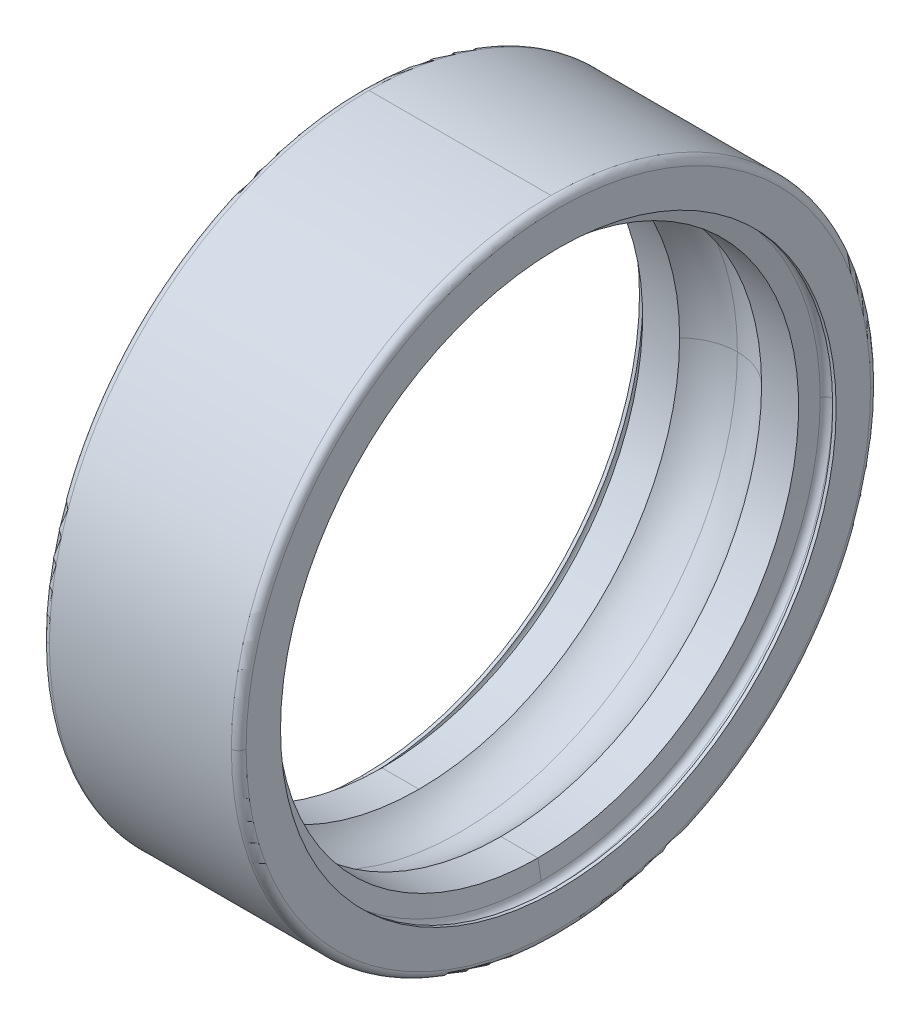
ISO-10303-21;
HEADER;
FILE_DESCRIPTION(('STEP AP214'),'2;1');
FILE_NAME('part.step','',(''),(''),'','','');
FILE_SCHEMA(('AUTOMOTIVE_DESIGN { 1 0 10303 214 1 1 1 1 }'));
ENDSEC;
DATA;
#1=APPLICATION_CONTEXT('core data for automotive mechanical design processes');
#2=APPLICATION_PROTOCOL_DEFINITION('international standard','automotive_design',2000,#1);
#3=PRODUCT_CONTEXT('',#1,'mechanical');
#4=PRODUCT('Part','Part','',(#3));
#5=PRODUCT_RELATED_PRODUCT_CATEGORY('part','',(#4));
#6=PRODUCT_DEFINITION_FORMATION('','',#4);
#7=PRODUCT_DEFINITION_CONTEXT('part definition',#1,'design');
#8=PRODUCT_DEFINITION('design','',#6,#7);
#9=PRODUCT_DEFINITION_SHAPE('','',#8);
#10=(LENGTH_UNIT() NAMED_UNIT(*) SI_UNIT(.MILLI.,.METRE.));
#11=(NAMED_UNIT(*) PLANE_ANGLE_UNIT() SI_UNIT($,.RADIAN.));
#12=(NAMED_UNIT(*) SI_UNIT($,.STERADIAN.) SOLID_ANGLE_UNIT());
#13=UNCERTAINTY_MEASURE_WITH_UNIT(LENGTH_MEASURE(1.E-05),#10,'distance_accuracy_value','');
#14=(GEOMETRIC_REPRESENTATION_CONTEXT(3) GLOBAL_UNCERTAINTY_ASSIGNED_CONTEXT((#13)) GLOBAL_UNIT_ASSIGNED_CONTEXT((#10,
#11,#12)) REPRESENTATION_CONTEXT('',''));
#15=CARTESIAN_POINT('',(0.,0.,0.));
#16=DIRECTION('',(0.,0.,1.));
#17=DIRECTION('',(1.,0.,0.));
#18=AXIS2_PLACEMENT_3D('',#15,#16,#17);
#19=CARTESIAN_POINT('',(7.58,0.,0.));
#20=DIRECTION('',(1.,0.,0.));
#21=DIRECTION('',(0.,0.,-1.));
#22=AXIS2_PLACEMENT_3D('',#19,#20,#21);
#23=TOROIDAL_SURFACE('',#22,11.3,0.28);
#24=CARTESIAN_POINT('',(7.58,0.,0.));
#25=DIRECTION('',(1.,0.,0.));
#26=DIRECTION('',(0.,0.,1.));
#27=AXIS2_PLACEMENT_3D('',#24,#25,#26);
#28=CIRCLE('',#27,11.58);
#29=CARTESIAN_POINT('',(7.58,0.,-11.58));
#30=VERTEX_POINT('',#29);
#31=CARTESIAN_POINT('',(7.58,0.,11.58));
#32=VERTEX_POINT('',#31);
#33=EDGE_CURVE('E393',#30,#32,#28,.T.);
#34=ORIENTED_EDGE('',*,*,#33,.T.);
#35=CARTESIAN_POINT('',(7.58,0.,11.3));
#36=DIRECTION('',(0.,-1.,0.));
#37=DIRECTION('',(0.,0.,1.));
#38=AXIS2_PLACEMENT_3D('',#35,#36,#37);
#39=CIRCLE('',#38,0.28);
#40=CARTESIAN_POINT('',(7.30425382915658,0.,11.3486214897467));
#41=VERTEX_POINT('',#40);
#42=EDGE_CURVE('E295',#32,#41,#39,.T.);
#43=ORIENTED_EDGE('',*,*,#42,.T.);
#44=CARTESIAN_POINT('',(7.30425382915658,0.,0.));
#45=DIRECTION('',(1.,0.,0.));
#46=DIRECTION('',(0.,1.,0.));
#47=AXIS2_PLACEMENT_3D('',#44,#45,#46);
#48=CIRCLE('',#47,11.3486214897467);
#49=CARTESIAN_POINT('',(7.30425382915658,11.3486214897467,0.));
#50=VERTEX_POINT('',#49);
#51=EDGE_CURVE('E32',#50,#41,#48,.T.);
#52=ORIENTED_EDGE('',*,*,#51,.F.);
#53=CARTESIAN_POINT('',(7.30425382915658,0.,0.));
#54=DIRECTION('',(1.,0.,0.));
#55=DIRECTION('',(0.,1.,0.));
#56=AXIS2_PLACEMENT_3D('',#53,#54,#55);
#57=CIRCLE('',#56,11.3486214897467);
#58=CARTESIAN_POINT('',(7.30425382915658,0.,-11.3486214897467));
#59=VERTEX_POINT('',#58);
#60=EDGE_CURVE('E116',#59,#50,#57,.T.);
#61=ORIENTED_EDGE('',*,*,#60,.F.);
#62=CARTESIAN_POINT('',(7.58,0.,-11.3));
#63=DIRECTION('',(0.,-1.,0.));
#64=DIRECTION('',(0.,0.,-1.));
#65=AXIS2_PLACEMENT_3D('',#62,#63,#64);
#66=CIRCLE('',#65,0.28);
#67=EDGE_CURVE('E288',#59,#30,#66,.T.);
#68=ORIENTED_EDGE('',*,*,#67,.T.);
#69=EDGE_LOOP('',(#34,#43,#52,#61,#68));
#70=FACE_BOUND('',#69,.T.);
#71=ADVANCED_FACE('F16',(#70),#23,.F.);
#72=CARTESIAN_POINT('',(7.93,0.,0.));
#73=DIRECTION('',(1.,0.,0.));
#74=DIRECTION('',(0.,1.,0.));
#75=AXIS2_PLACEMENT_3D('',#72,#73,#74);
#76=CYLINDRICAL_SURFACE('',#75,11.3);
#77=DIRECTION('',(1.,0.,0.));
#78=VECTOR('',#77,1.);
#79=CARTESIAN_POINT('',(7.93,11.3,0.));
#80=LINE('',#79,#78);
#81=CARTESIAN_POINT('',(7.86,11.3,0.));
#82=VERTEX_POINT('',#81);
#83=CARTESIAN_POINT('',(8.,11.3,0.));
#84=VERTEX_POINT('',#83);
#85=EDGE_CURVE('E296',#82,#84,#80,.T.);
#86=ORIENTED_EDGE('',*,*,#85,.T.);
#87=CARTESIAN_POINT('',(8.,0.,0.));
#88=DIRECTION('',(1.,0.,0.));
#89=DIRECTION('',(0.,1.,0.));
#90=AXIS2_PLACEMENT_3D('',#87,#88,#89);
#91=CIRCLE('',#90,11.3);
#92=CARTESIAN_POINT('',(8.,-11.3,0.));
#93=VERTEX_POINT('',#92);
#94=EDGE_CURVE('E11',#84,#93,#91,.T.);
#95=ORIENTED_EDGE('',*,*,#94,.T.);
#96=DIRECTION('',(-1.,0.,0.));
#97=VECTOR('',#96,1.);
#98=CARTESIAN_POINT('',(7.93,-11.3,0.));
#99=LINE('',#98,#97);
#100=CARTESIAN_POINT('',(7.86,-11.3,0.));
#101=VERTEX_POINT('',#100);
#102=EDGE_CURVE('E188',#93,#101,#99,.T.);
#103=ORIENTED_EDGE('',*,*,#102,.T.);
#104=CARTESIAN_POINT('',(7.86,0.,0.));
#105=DIRECTION('',(1.,0.,0.));
#106=DIRECTION('',(0.,1.,0.));
#107=AXIS2_PLACEMENT_3D('',#104,#105,#106);
#108=CIRCLE('',#107,11.3);
#109=CARTESIAN_POINT('',(7.86,0.,11.3));
#110=VERTEX_POINT('',#109);
#111=EDGE_CURVE('E310',#110,#101,#108,.T.);
#112=ORIENTED_EDGE('',*,*,#111,.F.);
#113=CARTESIAN_POINT('',(7.86,0.,0.));
#114=DIRECTION('',(1.,0.,0.));
#115=DIRECTION('',(0.,1.,0.));
#116=AXIS2_PLACEMENT_3D('',#113,#114,#115);
#117=CIRCLE('',#116,11.3);
#118=EDGE_CURVE('E380',#82,#110,#117,.T.);
#119=ORIENTED_EDGE('',*,*,#118,.F.);
#120=EDGE_LOOP('',(#86,#95,#103,#112,#119));
#121=FACE_BOUND('',#120,.T.);
#122=ADVANCED_FACE('F306',(#121),#76,.F.);
#123=CARTESIAN_POINT('',(8.,12.,0.));
#124=DIRECTION('',(1.,0.,0.));
#125=DIRECTION('',(0.,1.,0.));
#126=AXIS2_PLACEMENT_3D('',#123,#124,#125);
#127=PLANE('',#126);
#128=ORIENTED_EDGE('',*,*,#94,.F.);
#129=CARTESIAN_POINT('',(8.,0.,0.));
#130=DIRECTION('',(1.,0.,0.));
#131=DIRECTION('',(0.,1.,0.));
#132=AXIS2_PLACEMENT_3D('',#129,#130,#131);
#133=CIRCLE('',#132,11.3);
#134=EDGE_CURVE('E183',#93,#84,#133,.T.);
#135=ORIENTED_EDGE('',*,*,#134,.F.);
#136=EDGE_LOOP('',(#128,#135));
#137=FACE_BOUND('',#136,.T.);
#138=CARTESIAN_POINT('',(8.,0.,0.));
#139=DIRECTION('',(1.,0.,0.));
#140=DIRECTION('',(0.,1.,0.));
#141=AXIS2_PLACEMENT_3D('',#138,#139,#140);
#142=CIRCLE('',#141,12.7);
#143=CARTESIAN_POINT('',(8.,0.,12.7));
#144=VERTEX_POINT('',#143);
#145=CARTESIAN_POINT('',(8.,0.,-12.7));
#146=VERTEX_POINT('',#145);
#147=EDGE_CURVE('E24',#144,#146,#142,.T.);
#148=ORIENTED_EDGE('',*,*,#147,.T.);
#149=CARTESIAN_POINT('',(8.,0.,0.));
#150=DIRECTION('',(1.,0.,0.));
#151=DIRECTION('',(0.,1.,0.));
#152=AXIS2_PLACEMENT_3D('',#149,#150,#151);
#153=CIRCLE('',#152,12.7);
#154=EDGE_CURVE('E162',#146,#144,#153,.T.);
#155=ORIENTED_EDGE('',*,*,#154,.T.);
#156=EDGE_LOOP('',(#148,#155));
#157=FACE_BOUND('',#156,.T.);
#158=ADVANCED_FACE('F161',(#137,#157),#127,.T.);
#159=CARTESIAN_POINT('',(7.7,0.,0.));
#160=DIRECTION('',(1.,0.,0.));
#161=DIRECTION('',(0.,0.,-1.));
#162=AXIS2_PLACEMENT_3D('',#159,#160,#161);
#163=TOROIDAL_SURFACE('',#162,12.7,0.3);
#164=CARTESIAN_POINT('',(7.7,0.,-12.7));
#165=DIRECTION('',(0.,-1.,0.));
#166=DIRECTION('',(0.,0.,-1.));
#167=AXIS2_PLACEMENT_3D('',#164,#165,#166);
#168=CIRCLE('',#167,0.3);
#169=CARTESIAN_POINT('',(7.7,0.,-13.));
#170=VERTEX_POINT('',#169);
#171=EDGE_CURVE('E174',#170,#146,#168,.T.);
#172=ORIENTED_EDGE('',*,*,#171,.T.);
#173=ORIENTED_EDGE('',*,*,#147,.F.);
#174=CARTESIAN_POINT('',(7.7,0.,12.7));
#175=DIRECTION('',(0.,-1.,0.));
#176=DIRECTION('',(0.,0.,1.));
#177=AXIS2_PLACEMENT_3D('',#174,#175,#176);
#178=CIRCLE('',#177,0.3);
#179=CARTESIAN_POINT('',(7.7,0.,13.));
#180=VERTEX_POINT('',#179);
#181=EDGE_CURVE('E176',#144,#180,#178,.T.);
#182=ORIENTED_EDGE('',*,*,#181,.T.);
#183=CARTESIAN_POINT('',(7.7,0.,0.));
#184=DIRECTION('',(1.,0.,0.));
#185=DIRECTION('',(0.,1.,0.));
#186=AXIS2_PLACEMENT_3D('',#183,#184,#185);
#187=CIRCLE('',#186,13.);
#188=CARTESIAN_POINT('',(7.7,-13.,0.));
#189=VERTEX_POINT('',#188);
#190=EDGE_CURVE('E204',#180,#189,#187,.T.);
#191=ORIENTED_EDGE('',*,*,#190,.T.);
#192=CARTESIAN_POINT('',(7.7,0.,0.));
#193=DIRECTION('',(1.,0.,0.));
#194=DIRECTION('',(0.,1.,0.));
#195=AXIS2_PLACEMENT_3D('',#192,#193,#194);
#196=CIRCLE('',#195,13.);
#197=EDGE_CURVE('E153',#189,#170,#196,.T.);
#198=ORIENTED_EDGE('',*,*,#197,.T.);
#199=EDGE_LOOP('',(#172,#173,#182,#191,#198));
#200=FACE_BOUND('',#199,.T.);
#201=ADVANCED_FACE('F179',(#200),#163,.T.);
#202=CARTESIAN_POINT('',(4.,0.,0.));
#203=DIRECTION('',(1.,0.,0.));
#204=DIRECTION('',(0.,1.,0.));
#205=AXIS2_PLACEMENT_3D('',#202,#203,#204);
#206=CYLINDRICAL_SURFACE('',#205,13.);
#207=DIRECTION('',(1.,0.,0.));
#208=VECTOR('',#207,1.);
#209=CARTESIAN_POINT('',(4.,13.,0.));
#210=LINE('',#209,#208);
#211=CARTESIAN_POINT('',(0.3,13.,0.));
#212=VERTEX_POINT('',#211);
#213=CARTESIAN_POINT('',(7.7,13.,0.));
#214=VERTEX_POINT('',#213);
#215=EDGE_CURVE('E177',#212,#214,#210,.T.);
#216=ORIENTED_EDGE('',*,*,#215,.T.);
#217=CARTESIAN_POINT('',(7.7,0.,0.));
#218=DIRECTION('',(1.,0.,0.));
#219=DIRECTION('',(0.,1.,0.));
#220=AXIS2_PLACEMENT_3D('',#217,#218,#219);
#221=CIRCLE('',#220,13.);
#222=EDGE_CURVE('E182',#170,#214,#221,.T.);
#223=ORIENTED_EDGE('',*,*,#222,.F.);
#224=ORIENTED_EDGE('',*,*,#197,.F.);
#225=DIRECTION('',(-1.,0.,0.));
#226=VECTOR('',#225,1.);
#227=CARTESIAN_POINT('',(4.,-13.,0.));
#228=LINE('',#227,#226);
#229=CARTESIAN_POINT('',(0.3,-13.,0.));
#230=VERTEX_POINT('',#229);
#231=EDGE_CURVE('E201',#189,#230,#228,.T.);
#232=ORIENTED_EDGE('',*,*,#231,.T.);
#233=CARTESIAN_POINT('',(0.3,0.,0.));
#234=DIRECTION('',(1.,0.,0.));
#235=DIRECTION('',(0.,1.,0.));
#236=AXIS2_PLACEMENT_3D('',#233,#234,#235);
#237=CIRCLE('',#236,13.);
#238=CARTESIAN_POINT('',(0.3,0.,-13.));
#239=VERTEX_POINT('',#238);
#240=EDGE_CURVE('E151',#230,#239,#237,.T.);
#241=ORIENTED_EDGE('',*,*,#240,.T.);
#242=CARTESIAN_POINT('',(0.3,0.,0.));
#243=DIRECTION('',(1.,0.,0.));
#244=DIRECTION('',(0.,1.,0.));
#245=AXIS2_PLACEMENT_3D('',#242,#243,#244);
#246=CIRCLE('',#245,13.);
#247=EDGE_CURVE('E216',#239,#212,#246,.T.);
#248=ORIENTED_EDGE('',*,*,#247,.T.);
#249=EDGE_LOOP('',(#216,#223,#224,#232,#241,#248));
#250=FACE_BOUND('',#249,.T.);
#251=ADVANCED_FACE('F453',(#250),#206,.T.);
#252=CARTESIAN_POINT('',(0.3,0.,0.));
#253=DIRECTION('',(1.,0.,0.));
#254=DIRECTION('',(0.,0.,-1.));
#255=AXIS2_PLACEMENT_3D('',#252,#253,#254);
#256=TOROIDAL_SURFACE('',#255,12.7,0.3);
#257=CARTESIAN_POINT('',(0.3,0.,-12.7));
#258=DIRECTION('',(0.,-1.,0.));
#259=DIRECTION('',(0.,0.,-1.));
#260=AXIS2_PLACEMENT_3D('',#257,#258,#259);
#261=CIRCLE('',#260,0.3);
#262=CARTESIAN_POINT('',(0.,0.,-12.7));
#263=VERTEX_POINT('',#262);
#264=EDGE_CURVE('E206',#263,#239,#261,.T.);
#265=ORIENTED_EDGE('',*,*,#264,.T.);
#266=ORIENTED_EDGE('',*,*,#240,.F.);
#267=CARTESIAN_POINT('',(0.3,0.,0.));
#268=DIRECTION('',(1.,0.,0.));
#269=DIRECTION('',(0.,1.,0.));
#270=AXIS2_PLACEMENT_3D('',#267,#268,#269);
#271=CIRCLE('',#270,13.);
#272=CARTESIAN_POINT('',(0.3,0.,13.));
#273=VERTEX_POINT('',#272);
#274=EDGE_CURVE('E198',#273,#230,#271,.T.);
#275=ORIENTED_EDGE('',*,*,#274,.F.);
#276=CARTESIAN_POINT('',(0.3,0.,12.7));
#277=DIRECTION('',(0.,-1.,0.));
#278=DIRECTION('',(0.,0.,1.));
#279=AXIS2_PLACEMENT_3D('',#276,#277,#278);
#280=CIRCLE('',#279,0.3);
#281=CARTESIAN_POINT('',(0.,0.,12.7));
#282=VERTEX_POINT('',#281);
#283=EDGE_CURVE('E213',#273,#282,#280,.T.);
#284=ORIENTED_EDGE('',*,*,#283,.T.);
#285=CARTESIAN_POINT('',(0.,0.,0.));
#286=DIRECTION('',(1.,0.,0.));
#287=DIRECTION('',(0.,1.,0.));
#288=AXIS2_PLACEMENT_3D('',#285,#286,#287);
#289=CIRCLE('',#288,12.7);
#290=EDGE_CURVE('E149',#282,#263,#289,.T.);
#291=ORIENTED_EDGE('',*,*,#290,.T.);
#292=EDGE_LOOP('',(#265,#266,#275,#284,#291));
#293=FACE_BOUND('',#292,.T.);
#294=ADVANCED_FACE('F486',(#293),#256,.T.);
#295=CARTESIAN_POINT('',(0.,12.,0.));
#296=DIRECTION('',(-1.,0.,0.));
#297=DIRECTION('',(0.,0.,1.));
#298=AXIS2_PLACEMENT_3D('',#295,#296,#297);
#299=PLANE('',#298);
#300=CARTESIAN_POINT('',(0.,0.,0.));
#301=DIRECTION('',(1.,0.,0.));
#302=DIRECTION('',(0.,1.,0.));
#303=AXIS2_PLACEMENT_3D('',#300,#301,#302);
#304=CIRCLE('',#303,11.3);
#305=CARTESIAN_POINT('',(0.,11.3,0.));
#306=VERTEX_POINT('',#305);
#307=CARTESIAN_POINT('',(0.,-11.3,0.));
#308=VERTEX_POINT('',#307);
#309=EDGE_CURVE('E146',#306,#308,#304,.T.);
#310=ORIENTED_EDGE('',*,*,#309,.T.);
#311=CARTESIAN_POINT('',(0.,0.,0.));
#312=DIRECTION('',(1.,0.,0.));
#313=DIRECTION('',(0.,1.,0.));
#314=AXIS2_PLACEMENT_3D('',#311,#312,#313);
#315=CIRCLE('',#314,11.3);
#316=EDGE_CURVE('E221',#308,#306,#315,.T.);
#317=ORIENTED_EDGE('',*,*,#316,.T.);
#318=EDGE_LOOP('',(#310,#317));
#319=FACE_BOUND('',#318,.T.);
#320=CARTESIAN_POINT('',(0.,0.,0.));
#321=DIRECTION('',(1.,0.,0.));
#322=DIRECTION('',(0.,1.,0.));
#323=AXIS2_PLACEMENT_3D('',#320,#321,#322);
#324=CIRCLE('',#323,12.7);
#325=EDGE_CURVE('E210',#263,#282,#324,.T.);
#326=ORIENTED_EDGE('',*,*,#325,.F.);
#327=ORIENTED_EDGE('',*,*,#290,.F.);
#328=EDGE_LOOP('',(#326,#327));
#329=FACE_BOUND('',#328,.T.);
#330=ADVANCED_FACE('F496',(#319,#329),#299,.T.);
#331=CARTESIAN_POINT('',(0.07,0.,0.));
#332=DIRECTION('',(1.,0.,0.));
#333=DIRECTION('',(0.,1.,0.));
#334=AXIS2_PLACEMENT_3D('',#331,#332,#333);
#335=CYLINDRICAL_SURFACE('',#334,11.3);
#336=DIRECTION('',(1.,0.,0.));
#337=VECTOR('',#336,1.);
#338=CARTESIAN_POINT('',(0.07,11.3,0.));
#339=LINE('',#338,#337);
#340=CARTESIAN_POINT('',(0.14,11.3,0.));
#341=VERTEX_POINT('',#340);
#342=EDGE_CURVE('E218',#306,#341,#339,.T.);
#343=ORIENTED_EDGE('',*,*,#342,.T.);
#344=CARTESIAN_POINT('',(0.14,0.,0.));
#345=DIRECTION('',(1.,0.,0.));
#346=DIRECTION('',(0.,1.,0.));
#347=AXIS2_PLACEMENT_3D('',#344,#345,#346);
#348=CIRCLE('',#347,11.3);
#349=CARTESIAN_POINT('',(0.14,0.,11.3));
#350=VERTEX_POINT('',#349);
#351=EDGE_CURVE('E144',#341,#350,#348,.T.);
#352=ORIENTED_EDGE('',*,*,#351,.T.);
#353=CARTESIAN_POINT('',(0.14,0.,0.));
#354=DIRECTION('',(1.,0.,0.));
#355=DIRECTION('',(0.,1.,0.));
#356=AXIS2_PLACEMENT_3D('',#353,#354,#355);
#357=CIRCLE('',#356,11.3);
#358=CARTESIAN_POINT('',(0.14,-11.3,0.));
#359=VERTEX_POINT('',#358);
#360=EDGE_CURVE('E230',#350,#359,#357,.T.);
#361=ORIENTED_EDGE('',*,*,#360,.T.);
#362=DIRECTION('',(-1.,0.,0.));
#363=VECTOR('',#362,1.);
#364=CARTESIAN_POINT('',(0.07,-11.3,0.));
#365=LINE('',#364,#363);
#366=EDGE_CURVE('E226',#359,#308,#365,.T.);
#367=ORIENTED_EDGE('',*,*,#366,.T.);
#368=ORIENTED_EDGE('',*,*,#309,.F.);
#369=EDGE_LOOP('',(#343,#352,#361,#367,#368));
#370=FACE_BOUND('',#369,.T.);
#371=ADVANCED_FACE('F506',(#370),#335,.F.);
#372=CARTESIAN_POINT('',(0.42,0.,0.));
#373=DIRECTION('',(1.,0.,0.));
#374=DIRECTION('',(0.,0.,-1.));
#375=AXIS2_PLACEMENT_3D('',#372,#373,#374);
#376=TOROIDAL_SURFACE('',#375,11.3,0.28);
#377=CARTESIAN_POINT('',(0.42,0.,0.));
#378=DIRECTION('',(1.,0.,0.));
#379=DIRECTION('',(0.,0.,1.));
#380=AXIS2_PLACEMENT_3D('',#377,#378,#379);
#381=CIRCLE('',#380,11.58);
#382=CARTESIAN_POINT('',(0.42,0.,-11.58));
#383=VERTEX_POINT('',#382);
#384=CARTESIAN_POINT('',(0.42,0.,11.58));
#385=VERTEX_POINT('',#384);
#386=EDGE_CURVE('E375',#383,#385,#381,.T.);
#387=ORIENTED_EDGE('',*,*,#386,.T.);
#388=CARTESIAN_POINT('',(0.42,0.,11.3));
#389=DIRECTION('',(0.,-1.,0.));
#390=DIRECTION('',(0.,0.,1.));
#391=AXIS2_PLACEMENT_3D('',#388,#389,#390);
#392=CIRCLE('',#391,0.28);
#393=EDGE_CURVE('E232',#385,#350,#392,.T.);
#394=ORIENTED_EDGE('',*,*,#393,.T.);
#395=ORIENTED_EDGE('',*,*,#351,.F.);
#396=CARTESIAN_POINT('',(0.14,0.,0.));
#397=DIRECTION('',(1.,0.,0.));
#398=DIRECTION('',(0.,1.,0.));
#399=AXIS2_PLACEMENT_3D('',#396,#397,#398);
#400=CIRCLE('',#399,11.3);
#401=CARTESIAN_POINT('',(0.14,0.,-11.3));
#402=VERTEX_POINT('',#401);
#403=EDGE_CURVE('E225',#402,#341,#400,.T.);
#404=ORIENTED_EDGE('',*,*,#403,.F.);
#405=CARTESIAN_POINT('',(0.42,0.,-11.3));
#406=DIRECTION('',(0.,-1.,0.));
#407=DIRECTION('',(0.,0.,-1.));
#408=AXIS2_PLACEMENT_3D('',#405,#406,#407);
#409=CIRCLE('',#408,0.28);
#410=EDGE_CURVE('E227',#402,#383,#409,.T.);
#411=ORIENTED_EDGE('',*,*,#410,.T.);
#412=EDGE_LOOP('',(#387,#394,#395,#404,#411));
#413=FACE_BOUND('',#412,.T.);
#414=ADVANCED_FACE('F516',(#413),#376,.F.);
#415=CARTESIAN_POINT('',(0.761747254333677,0.,0.));
#416=DIRECTION('',(-1.,0.,0.));
#417=DIRECTION('',(0.,1.,0.));
#418=AXIS2_PLACEMENT_3D('',#415,#416,#417);
#419=CONICAL_SURFACE('',#418,10.9743107448734,1.39626340159546);
#420=DIRECTION('',(0.173648177666931,-0.984807753012208,0.));
#421=VECTOR('',#420,1.);
#422=CARTESIAN_POINT('',(0.761747254333677,10.9743107448734,0.));
#423=LINE('',#422,#421);
#424=CARTESIAN_POINT('',(0.695746170843419,11.3486214897467,0.));
#425=VERTEX_POINT('',#424);
#426=CARTESIAN_POINT('',(0.827748337823935,10.6,0.));
#427=VERTEX_POINT('',#426);
#428=EDGE_CURVE('E233',#425,#427,#423,.T.);
#429=ORIENTED_EDGE('',*,*,#428,.T.);
#430=CARTESIAN_POINT('',(0.827748337823935,0.,0.));
#431=DIRECTION('',(1.,0.,0.));
#432=DIRECTION('',(0.,1.,0.));
#433=AXIS2_PLACEMENT_3D('',#430,#431,#432);
#434=CIRCLE('',#433,10.6);
#435=CARTESIAN_POINT('',(0.827748337823935,-10.6,0.));
#436=VERTEX_POINT('',#435);
#437=EDGE_CURVE('E141',#427,#436,#434,.T.);
#438=ORIENTED_EDGE('',*,*,#437,.T.);
#439=DIRECTION('',(-0.173648177666931,-0.984807753012208,0.));
#440=VECTOR('',#439,1.);
#441=CARTESIAN_POINT('',(0.761747254333677,-10.9743107448734,0.));
#442=LINE('',#441,#440);
#443=CARTESIAN_POINT('',(0.695746170843419,-11.3486214897467,0.));
#444=VERTEX_POINT('',#443);
#445=EDGE_CURVE('E236',#436,#444,#442,.T.);
#446=ORIENTED_EDGE('',*,*,#445,.T.);
#447=CARTESIAN_POINT('',(0.695746170843419,0.,0.));
#448=DIRECTION('',(1.,0.,0.));
#449=DIRECTION('',(0.,1.,0.));
#450=AXIS2_PLACEMENT_3D('',#447,#448,#449);
#451=CIRCLE('',#450,11.3486214897467);
#452=CARTESIAN_POINT('',(0.695746170843419,0.,11.3486214897467));
#453=VERTEX_POINT('',#452);
#454=EDGE_CURVE('E340',#453,#444,#451,.T.);
#455=ORIENTED_EDGE('',*,*,#454,.F.);
#456=CARTESIAN_POINT('',(0.695746170843419,0.,0.));
#457=DIRECTION('',(1.,0.,0.));
#458=DIRECTION('',(0.,1.,0.));
#459=AXIS2_PLACEMENT_3D('',#456,#457,#458);
#460=CIRCLE('',#459,11.3486214897467);
#461=EDGE_CURVE('E366',#425,#453,#460,.T.);
#462=ORIENTED_EDGE('',*,*,#461,.F.);
#463=EDGE_LOOP('',(#429,#438,#446,#455,#462));
#464=FACE_BOUND('',#463,.T.);
#465=ADVANCED_FACE('F526',(#464),#419,.F.);
#466=CARTESIAN_POINT('',(1.58033337806847,0.,0.));
#467=DIRECTION('',(1.,0.,0.));
#468=DIRECTION('',(0.,1.,0.));
#469=AXIS2_PLACEMENT_3D('',#466,#467,#468);
#470=CYLINDRICAL_SURFACE('',#469,10.6);
#471=DIRECTION('',(1.,0.,0.));
#472=VECTOR('',#471,1.);
#473=CARTESIAN_POINT('',(1.58033337806847,10.6,0.));
#474=LINE('',#473,#472);
#475=CARTESIAN_POINT('',(2.33291841831301,10.6,0.));
#476=VERTEX_POINT('',#475);
#477=EDGE_CURVE('E237',#427,#476,#474,.T.);
#478=ORIENTED_EDGE('',*,*,#477,.T.);
#479=CARTESIAN_POINT('',(2.33291841831301,0.,0.));
#480=DIRECTION('',(1.,0.,0.));
#481=DIRECTION('',(0.,1.,0.));
#482=AXIS2_PLACEMENT_3D('',#479,#480,#481);
#483=CIRCLE('',#482,10.6);
#484=CARTESIAN_POINT('',(2.33291841831301,0.,10.6));
#485=VERTEX_POINT('',#484);
#486=EDGE_CURVE('E92',#476,#485,#483,.T.);
#487=ORIENTED_EDGE('',*,*,#486,.T.);
#488=CARTESIAN_POINT('',(2.33291841831301,0.,0.));
#489=DIRECTION('',(1.,0.,0.));
#490=DIRECTION('',(0.,1.,0.));
#491=AXIS2_PLACEMENT_3D('',#488,#489,#490);
#492=CIRCLE('',#491,10.6);
#493=CARTESIAN_POINT('',(2.33291841831301,-10.6,0.));
#494=VERTEX_POINT('',#493);
#495=EDGE_CURVE('E136',#485,#494,#492,.T.);
#496=ORIENTED_EDGE('',*,*,#495,.T.);
#497=DIRECTION('',(-1.,0.,0.));
#498=VECTOR('',#497,1.);
#499=CARTESIAN_POINT('',(1.58033337806847,-10.6,0.));
#500=LINE('',#499,#498);
#501=EDGE_CURVE('E239',#494,#436,#500,.T.);
#502=ORIENTED_EDGE('',*,*,#501,.T.);
#503=ORIENTED_EDGE('',*,*,#437,.F.);
#504=EDGE_LOOP('',(#478,#487,#496,#502,#503));
#505=FACE_BOUND('',#504,.T.);
#506=ADVANCED_FACE('F257',(#505),#470,.F.);
#507=CARTESIAN_POINT('',(4.,0.,0.));
#508=DIRECTION('',(1.,0.,0.));
#509=DIRECTION('',(0.,0.,-1.));
#510=AXIS2_PLACEMENT_3D('',#507,#508,#509);
#511=TOROIDAL_SURFACE('',#510,8.9,2.381);
#512=CARTESIAN_POINT('',(4.,0.,0.));
#513=DIRECTION('',(1.,0.,0.));
#514=DIRECTION('',(0.,0.,1.));
#515=AXIS2_PLACEMENT_3D('',#512,#513,#514);
#516=CIRCLE('',#515,11.281);
#517=CARTESIAN_POINT('',(4.,0.,-11.281));
#518=VERTEX_POINT('',#517);
#519=CARTESIAN_POINT('',(4.,0.,11.281));
#520=VERTEX_POINT('',#519);
#521=EDGE_CURVE('E360',#518,#520,#516,.T.);
#522=ORIENTED_EDGE('',*,*,#521,.T.);
#523=CARTESIAN_POINT('',(4.,0.,8.9));
#524=DIRECTION('',(0.,-1.,0.));
#525=DIRECTION('',(0.,0.,1.));
#526=AXIS2_PLACEMENT_3D('',#523,#524,#525);
#527=CIRCLE('',#526,2.381);
#528=EDGE_CURVE('E133',#520,#485,#527,.T.);
#529=ORIENTED_EDGE('',*,*,#528,.T.);
#530=ORIENTED_EDGE('',*,*,#486,.F.);
#531=CARTESIAN_POINT('',(2.33291841831301,0.,0.));
#532=DIRECTION('',(1.,0.,0.));
#533=DIRECTION('',(0.,1.,0.));
#534=AXIS2_PLACEMENT_3D('',#531,#532,#533);
#535=CIRCLE('',#534,10.6);
#536=CARTESIAN_POINT('',(2.33291841831301,0.,-10.6));
#537=VERTEX_POINT('',#536);
#538=EDGE_CURVE('E246',#537,#476,#535,.T.);
#539=ORIENTED_EDGE('',*,*,#538,.F.);
#540=CARTESIAN_POINT('',(4.,0.,-8.9));
#541=DIRECTION('',(0.,-1.,0.));
#542=DIRECTION('',(0.,0.,-1.));
#543=AXIS2_PLACEMENT_3D('',#540,#541,#542);
#544=CIRCLE('',#543,2.381);
#545=EDGE_CURVE('E248',#537,#518,#544,.T.);
#546=ORIENTED_EDGE('',*,*,#545,.T.);
#547=EDGE_LOOP('',(#522,#529,#530,#539,#546));
#548=FACE_BOUND('',#547,.T.);
#549=ADVANCED_FACE('F544',(#548),#511,.F.);
#550=CARTESIAN_POINT('',(6.41966662193153,0.,0.));
#551=DIRECTION('',(1.,0.,0.));
#552=DIRECTION('',(0.,1.,0.));
#553=AXIS2_PLACEMENT_3D('',#550,#551,#552);
#554=CYLINDRICAL_SURFACE('',#553,10.6);
#555=DIRECTION('',(1.,0.,0.));
#556=VECTOR('',#555,1.);
#557=CARTESIAN_POINT('',(6.41966662193153,10.6,0.));
#558=LINE('',#557,#556);
#559=CARTESIAN_POINT('',(5.66708158168699,10.6,0.));
#560=VERTEX_POINT('',#559);
#561=CARTESIAN_POINT('',(7.17225166217606,10.6,0.));
#562=VERTEX_POINT('',#561);
#563=EDGE_CURVE('E123',#560,#562,#558,.T.);
#564=ORIENTED_EDGE('',*,*,#563,.T.);
#565=CARTESIAN_POINT('',(7.17225166217606,0.,0.));
#566=DIRECTION('',(1.,0.,0.));
#567=DIRECTION('',(0.,1.,0.));
#568=AXIS2_PLACEMENT_3D('',#565,#566,#567);
#569=CIRCLE('',#568,10.6);
#570=CARTESIAN_POINT('',(7.17225166217606,-10.6,0.));
#571=VERTEX_POINT('',#570);
#572=EDGE_CURVE('E98',#562,#571,#569,.T.);
#573=ORIENTED_EDGE('',*,*,#572,.T.);
#574=DIRECTION('',(-1.,0.,0.));
#575=VECTOR('',#574,1.);
#576=CARTESIAN_POINT('',(6.41966662193153,-10.6,0.));
#577=LINE('',#576,#575);
#578=CARTESIAN_POINT('',(5.66708158168699,-10.6,0.));
#579=VERTEX_POINT('',#578);
#580=EDGE_CURVE('E126',#571,#579,#577,.T.);
#581=ORIENTED_EDGE('',*,*,#580,.T.);
#582=CARTESIAN_POINT('',(5.66708158168699,0.,0.));
#583=DIRECTION('',(1.,0.,0.));
#584=DIRECTION('',(0.,1.,0.));
#585=AXIS2_PLACEMENT_3D('',#582,#583,#584);
#586=CIRCLE('',#585,10.6);
#587=CARTESIAN_POINT('',(5.66708158168699,0.,10.6));
#588=VERTEX_POINT('',#587);
#589=EDGE_CURVE('E350',#588,#579,#586,.T.);
#590=ORIENTED_EDGE('',*,*,#589,.F.);
#591=CARTESIAN_POINT('',(5.66708158168699,0.,0.));
#592=DIRECTION('',(1.,0.,0.));
#593=DIRECTION('',(0.,1.,0.));
#594=AXIS2_PLACEMENT_3D('',#591,#592,#593);
#595=CIRCLE('',#594,10.6);
#596=EDGE_CURVE('E131',#560,#588,#595,.T.);
#597=ORIENTED_EDGE('',*,*,#596,.F.);
#598=EDGE_LOOP('',(#564,#573,#581,#590,#597));
#599=FACE_BOUND('',#598,.T.);
#600=ADVANCED_FACE('F128',(#599),#554,.F.);
#601=CARTESIAN_POINT('',(7.23825274566632,0.,0.));
#602=DIRECTION('',(1.,0.,0.));
#603=DIRECTION('',(0.,1.,0.));
#604=AXIS2_PLACEMENT_3D('',#601,#602,#603);
#605=CONICAL_SURFACE('',#604,10.9743107448734,1.39626340159546);
#606=DIRECTION('',(0.173648177666931,0.984807753012208,0.));
#607=VECTOR('',#606,1.);
#608=CARTESIAN_POINT('',(7.23825274566632,10.9743107448734,0.));
#609=LINE('',#608,#607);
#610=EDGE_CURVE('E101',#562,#50,#609,.T.);
#611=ORIENTED_EDGE('',*,*,#610,.T.);
#612=ORIENTED_EDGE('',*,*,#51,.T.);
#613=CARTESIAN_POINT('',(7.30425382915658,0.,0.));
#614=DIRECTION('',(1.,0.,0.));
#615=DIRECTION('',(0.,1.,0.));
#616=AXIS2_PLACEMENT_3D('',#613,#614,#615);
#617=CIRCLE('',#616,11.3486214897467);
#618=CARTESIAN_POINT('',(7.30425382915658,-11.3486214897467,0.));
#619=VERTEX_POINT('',#618);
#620=EDGE_CURVE('E293',#41,#619,#617,.T.);
#621=ORIENTED_EDGE('',*,*,#620,.T.);
#622=DIRECTION('',(-0.173648177666931,0.984807753012208,0.));
#623=VECTOR('',#622,1.);
#624=CARTESIAN_POINT('',(7.23825274566632,-10.9743107448734,0.));
#625=LINE('',#624,#623);
#626=EDGE_CURVE('E104',#619,#571,#625,.T.);
#627=ORIENTED_EDGE('',*,*,#626,.T.);
#628=ORIENTED_EDGE('',*,*,#572,.F.);
#629=EDGE_LOOP('',(#611,#612,#621,#627,#628));
#630=FACE_BOUND('',#629,.T.);
#631=ADVANCED_FACE('F100',(#630),#605,.F.);
#632=CARTESIAN_POINT('',(7.23825274566632,0.,0.));
#633=DIRECTION('',(1.,0.,0.));
#634=DIRECTION('',(0.,1.,0.));
#635=AXIS2_PLACEMENT_3D('',#632,#633,#634);
#636=CONICAL_SURFACE('',#635,10.9743107448734,1.39626340159546);
#637=ORIENTED_EDGE('',*,*,#610,.F.);
#638=CARTESIAN_POINT('',(7.17225166217606,0.,0.));
#639=DIRECTION('',(1.,0.,0.));
#640=DIRECTION('',(0.,1.,0.));
#641=AXIS2_PLACEMENT_3D('',#638,#639,#640);
#642=CIRCLE('',#641,10.6);
#643=EDGE_CURVE('E113',#571,#562,#642,.T.);
#644=ORIENTED_EDGE('',*,*,#643,.F.);
#645=ORIENTED_EDGE('',*,*,#626,.F.);
#646=CARTESIAN_POINT('',(7.30425382915658,0.,0.));
#647=DIRECTION('',(1.,0.,0.));
#648=DIRECTION('',(0.,1.,0.));
#649=AXIS2_PLACEMENT_3D('',#646,#647,#648);
#650=CIRCLE('',#649,11.3486214897467);
#651=EDGE_CURVE('E290',#619,#59,#650,.T.);
#652=ORIENTED_EDGE('',*,*,#651,.T.);
#653=ORIENTED_EDGE('',*,*,#60,.T.);
#654=EDGE_LOOP('',(#637,#644,#645,#652,#653));
#655=FACE_BOUND('',#654,.T.);
#656=ADVANCED_FACE('F112',(#655),#636,.F.);
#657=CARTESIAN_POINT('',(6.41966662193153,0.,0.));
#658=DIRECTION('',(1.,0.,0.));
#659=DIRECTION('',(0.,1.,0.));
#660=AXIS2_PLACEMENT_3D('',#657,#658,#659);
#661=CYLINDRICAL_SURFACE('',#660,10.6);
#662=ORIENTED_EDGE('',*,*,#563,.F.);
#663=CARTESIAN_POINT('',(5.66708158168699,0.,0.));
#664=DIRECTION('',(1.,0.,0.));
#665=DIRECTION('',(0.,1.,0.));
#666=AXIS2_PLACEMENT_3D('',#663,#664,#665);
#667=CIRCLE('',#666,10.6);
#668=CARTESIAN_POINT('',(5.66708158168699,0.,-10.6));
#669=VERTEX_POINT('',#668);
#670=EDGE_CURVE('E384',#669,#560,#667,.T.);
#671=ORIENTED_EDGE('',*,*,#670,.F.);
#672=CARTESIAN_POINT('',(5.66708158168699,0.,0.));
#673=DIRECTION('',(1.,0.,0.));
#674=DIRECTION('',(0.,1.,0.));
#675=AXIS2_PLACEMENT_3D('',#672,#673,#674);
#676=CIRCLE('',#675,10.6);
#677=EDGE_CURVE('E347',#579,#669,#676,.T.);
#678=ORIENTED_EDGE('',*,*,#677,.F.);
#679=ORIENTED_EDGE('',*,*,#580,.F.);
#680=ORIENTED_EDGE('',*,*,#643,.T.);
#681=EDGE_LOOP('',(#662,#671,#678,#679,#680));
#682=FACE_BOUND('',#681,.T.);
#683=ADVANCED_FACE('F120',(#682),#661,.F.);
#684=CARTESIAN_POINT('',(4.,0.,0.));
#685=DIRECTION('',(1.,0.,0.));
#686=DIRECTION('',(0.,0.,-1.));
#687=AXIS2_PLACEMENT_3D('',#684,#685,#686);
#688=TOROIDAL_SURFACE('',#687,8.9,2.381);
#689=CARTESIAN_POINT('',(4.,0.,0.));
#690=DIRECTION('',(1.,0.,0.));
#691=DIRECTION('',(0.,0.,1.));
#692=AXIS2_PLACEMENT_3D('',#689,#690,#691);
#693=CIRCLE('',#692,11.281);
#694=EDGE_CURVE('E355',#520,#518,#693,.T.);
#695=ORIENTED_EDGE('',*,*,#694,.T.);
#696=ORIENTED_EDGE('',*,*,#545,.F.);
#697=CARTESIAN_POINT('',(2.33291841831301,0.,0.));
#698=DIRECTION('',(1.,0.,0.));
#699=DIRECTION('',(0.,1.,0.));
#700=AXIS2_PLACEMENT_3D('',#697,#698,#699);
#701=CIRCLE('',#700,10.6);
#702=EDGE_CURVE('E243',#494,#537,#701,.T.);
#703=ORIENTED_EDGE('',*,*,#702,.F.);
#704=ORIENTED_EDGE('',*,*,#495,.F.);
#705=ORIENTED_EDGE('',*,*,#528,.F.);
#706=EDGE_LOOP('',(#695,#696,#703,#704,#705));
#707=FACE_BOUND('',#706,.T.);
#708=ADVANCED_FACE('F263',(#707),#688,.F.);
#709=CARTESIAN_POINT('',(1.58033337806847,0.,0.));
#710=DIRECTION('',(1.,0.,0.));
#711=DIRECTION('',(0.,1.,0.));
#712=AXIS2_PLACEMENT_3D('',#709,#710,#711);
#713=CYLINDRICAL_SURFACE('',#712,10.6);
#714=ORIENTED_EDGE('',*,*,#477,.F.);
#715=CARTESIAN_POINT('',(0.827748337823935,0.,0.));
#716=DIRECTION('',(1.,0.,0.));
#717=DIRECTION('',(0.,1.,0.));
#718=AXIS2_PLACEMENT_3D('',#715,#716,#717);
#719=CIRCLE('',#718,10.6);
#720=EDGE_CURVE('E240',#436,#427,#719,.T.);
#721=ORIENTED_EDGE('',*,*,#720,.F.);
#722=ORIENTED_EDGE('',*,*,#501,.F.);
#723=ORIENTED_EDGE('',*,*,#702,.T.);
#724=ORIENTED_EDGE('',*,*,#538,.T.);
#725=EDGE_LOOP('',(#714,#721,#722,#723,#724));
#726=FACE_BOUND('',#725,.T.);
#727=ADVANCED_FACE('F266',(#726),#713,.F.);
#728=CARTESIAN_POINT('',(0.761747254333677,0.,0.));
#729=DIRECTION('',(-1.,0.,0.));
#730=DIRECTION('',(0.,1.,0.));
#731=AXIS2_PLACEMENT_3D('',#728,#729,#730);
#732=CONICAL_SURFACE('',#731,10.9743107448734,1.39626340159546);
#733=ORIENTED_EDGE('',*,*,#428,.F.);
#734=CARTESIAN_POINT('',(0.695746170843419,0.,0.));
#735=DIRECTION('',(1.,0.,0.));
#736=DIRECTION('',(0.,1.,0.));
#737=AXIS2_PLACEMENT_3D('',#734,#735,#736);
#738=CIRCLE('',#737,11.3486214897467);
#739=CARTESIAN_POINT('',(0.695746170843419,0.,-11.3486214897467));
#740=VERTEX_POINT('',#739);
#741=EDGE_CURVE('E369',#740,#425,#738,.T.);
#742=ORIENTED_EDGE('',*,*,#741,.F.);
#743=CARTESIAN_POINT('',(0.695746170843419,0.,0.));
#744=DIRECTION('',(1.,0.,0.));
#745=DIRECTION('',(0.,1.,0.));
#746=AXIS2_PLACEMENT_3D('',#743,#744,#745);
#747=CIRCLE('',#746,11.3486214897467);
#748=EDGE_CURVE('E279',#444,#740,#747,.T.);
#749=ORIENTED_EDGE('',*,*,#748,.F.);
#750=ORIENTED_EDGE('',*,*,#445,.F.);
#751=ORIENTED_EDGE('',*,*,#720,.T.);
#752=EDGE_LOOP('',(#733,#742,#749,#750,#751));
#753=FACE_BOUND('',#752,.T.);
#754=ADVANCED_FACE('F275',(#753),#732,.F.);
#755=CARTESIAN_POINT('',(0.42,0.,0.));
#756=DIRECTION('',(1.,0.,0.));
#757=DIRECTION('',(0.,0.,-1.));
#758=AXIS2_PLACEMENT_3D('',#755,#756,#757);
#759=TOROIDAL_SURFACE('',#758,11.3,0.28);
#760=CARTESIAN_POINT('',(0.42,0.,0.));
#761=DIRECTION('',(1.,0.,0.));
#762=DIRECTION('',(0.,0.,1.));
#763=AXIS2_PLACEMENT_3D('',#760,#761,#762);
#764=CIRCLE('',#763,11.58);
#765=EDGE_CURVE('E342',#385,#383,#764,.T.);
#766=ORIENTED_EDGE('',*,*,#765,.T.);
#767=ORIENTED_EDGE('',*,*,#410,.F.);
#768=CARTESIAN_POINT('',(0.14,0.,0.));
#769=DIRECTION('',(1.,0.,0.));
#770=DIRECTION('',(0.,1.,0.));
#771=AXIS2_PLACEMENT_3D('',#768,#769,#770);
#772=CIRCLE('',#771,11.3);
#773=EDGE_CURVE('E222',#359,#402,#772,.T.);
#774=ORIENTED_EDGE('',*,*,#773,.F.);
#775=ORIENTED_EDGE('',*,*,#360,.F.);
#776=ORIENTED_EDGE('',*,*,#393,.F.);
#777=EDGE_LOOP('',(#766,#767,#774,#775,#776));
#778=FACE_BOUND('',#777,.T.);
#779=ADVANCED_FACE('F609',(#778),#759,.F.);
#780=CARTESIAN_POINT('',(0.07,0.,0.));
#781=DIRECTION('',(1.,0.,0.));
#782=DIRECTION('',(0.,1.,0.));
#783=AXIS2_PLACEMENT_3D('',#780,#781,#782);
#784=CYLINDRICAL_SURFACE('',#783,11.3);
#785=ORIENTED_EDGE('',*,*,#342,.F.);
#786=ORIENTED_EDGE('',*,*,#316,.F.);
#787=ORIENTED_EDGE('',*,*,#366,.F.);
#788=ORIENTED_EDGE('',*,*,#773,.T.);
#789=ORIENTED_EDGE('',*,*,#403,.T.);
#790=EDGE_LOOP('',(#785,#786,#787,#788,#789));
#791=FACE_BOUND('',#790,.T.);
#792=ADVANCED_FACE('F618',(#791),#784,.F.);
#793=CARTESIAN_POINT('',(0.3,0.,0.));
#794=DIRECTION('',(1.,0.,0.));
#795=DIRECTION('',(0.,0.,-1.));
#796=AXIS2_PLACEMENT_3D('',#793,#794,#795);
#797=TOROIDAL_SURFACE('',#796,12.7,0.3);
#798=ORIENTED_EDGE('',*,*,#264,.F.);
#799=ORIENTED_EDGE('',*,*,#325,.T.);
#800=ORIENTED_EDGE('',*,*,#283,.F.);
#801=CARTESIAN_POINT('',(0.3,0.,0.));
#802=DIRECTION('',(1.,0.,0.));
#803=DIRECTION('',(0.,1.,0.));
#804=AXIS2_PLACEMENT_3D('',#801,#802,#803);
#805=CIRCLE('',#804,13.);
#806=EDGE_CURVE('E194',#212,#273,#805,.T.);
#807=ORIENTED_EDGE('',*,*,#806,.F.);
#808=ORIENTED_EDGE('',*,*,#247,.F.);
#809=EDGE_LOOP('',(#798,#799,#800,#807,#808));
#810=FACE_BOUND('',#809,.T.);
#811=ADVANCED_FACE('F628',(#810),#797,.T.);
#812=CARTESIAN_POINT('',(4.,0.,0.));
#813=DIRECTION('',(1.,0.,0.));
#814=DIRECTION('',(0.,1.,0.));
#815=AXIS2_PLACEMENT_3D('',#812,#813,#814);
#816=CYLINDRICAL_SURFACE('',#815,13.);
#817=ORIENTED_EDGE('',*,*,#215,.F.);
#818=ORIENTED_EDGE('',*,*,#806,.T.);
#819=ORIENTED_EDGE('',*,*,#274,.T.);
#820=ORIENTED_EDGE('',*,*,#231,.F.);
#821=ORIENTED_EDGE('',*,*,#190,.F.);
#822=CARTESIAN_POINT('',(7.7,0.,0.));
#823=DIRECTION('',(1.,0.,0.));
#824=DIRECTION('',(0.,1.,0.));
#825=AXIS2_PLACEMENT_3D('',#822,#823,#824);
#826=CIRCLE('',#825,13.);
#827=EDGE_CURVE('E185',#214,#180,#826,.T.);
#828=ORIENTED_EDGE('',*,*,#827,.F.);
#829=EDGE_LOOP('',(#817,#818,#819,#820,#821,#828));
#830=FACE_BOUND('',#829,.T.);
#831=ADVANCED_FACE('F638',(#830),#816,.T.);
#832=CARTESIAN_POINT('',(7.7,0.,0.));
#833=DIRECTION('',(1.,0.,0.));
#834=DIRECTION('',(0.,0.,-1.));
#835=AXIS2_PLACEMENT_3D('',#832,#833,#834);
#836=TOROIDAL_SURFACE('',#835,12.7,0.3);
#837=ORIENTED_EDGE('',*,*,#171,.F.);
#838=ORIENTED_EDGE('',*,*,#222,.T.);
#839=ORIENTED_EDGE('',*,*,#827,.T.);
#840=ORIENTED_EDGE('',*,*,#181,.F.);
#841=ORIENTED_EDGE('',*,*,#154,.F.);
#842=EDGE_LOOP('',(#837,#838,#839,#840,#841));
#843=FACE_BOUND('',#842,.T.);
#844=ADVANCED_FACE('F172',(#843),#836,.T.);
#845=CARTESIAN_POINT('',(7.93,0.,0.));
#846=DIRECTION('',(1.,0.,0.));
#847=DIRECTION('',(0.,1.,0.));
#848=AXIS2_PLACEMENT_3D('',#845,#846,#847);
#849=CYLINDRICAL_SURFACE('',#848,11.3);
#850=ORIENTED_EDGE('',*,*,#85,.F.);
#851=CARTESIAN_POINT('',(7.86,0.,0.));
#852=DIRECTION('',(1.,0.,0.));
#853=DIRECTION('',(0.,1.,0.));
#854=AXIS2_PLACEMENT_3D('',#851,#852,#853);
#855=CIRCLE('',#854,11.3);
#856=CARTESIAN_POINT('',(7.86,0.,-11.3));
#857=VERTEX_POINT('',#856);
#858=EDGE_CURVE('E324',#857,#82,#855,.T.);
#859=ORIENTED_EDGE('',*,*,#858,.F.);
#860=CARTESIAN_POINT('',(7.86,0.,0.));
#861=DIRECTION('',(1.,0.,0.));
#862=DIRECTION('',(0.,1.,0.));
#863=AXIS2_PLACEMENT_3D('',#860,#861,#862);
#864=CIRCLE('',#863,11.3);
#865=EDGE_CURVE('E286',#101,#857,#864,.T.);
#866=ORIENTED_EDGE('',*,*,#865,.F.);
#867=ORIENTED_EDGE('',*,*,#102,.F.);
#868=ORIENTED_EDGE('',*,*,#134,.T.);
#869=EDGE_LOOP('',(#850,#859,#866,#867,#868));
#870=FACE_BOUND('',#869,.T.);
#871=ADVANCED_FACE('F321',(#870),#849,.F.);
#872=CARTESIAN_POINT('',(7.58,0.,0.));
#873=DIRECTION('',(1.,0.,0.));
#874=DIRECTION('',(0.,0.,-1.));
#875=AXIS2_PLACEMENT_3D('',#872,#873,#874);
#876=TOROIDAL_SURFACE('',#875,11.3,0.28);
#877=CARTESIAN_POINT('',(7.58,0.,0.));
#878=DIRECTION('',(1.,0.,0.));
#879=DIRECTION('',(0.,0.,1.));
#880=AXIS2_PLACEMENT_3D('',#877,#878,#879);
#881=CIRCLE('',#880,11.58);
#882=EDGE_CURVE('E333',#32,#30,#881,.T.);
#883=ORIENTED_EDGE('',*,*,#882,.T.);
#884=ORIENTED_EDGE('',*,*,#67,.F.);
#885=ORIENTED_EDGE('',*,*,#651,.F.);
#886=ORIENTED_EDGE('',*,*,#620,.F.);
#887=ORIENTED_EDGE('',*,*,#42,.F.);
#888=EDGE_LOOP('',(#883,#884,#885,#886,#887));
#889=FACE_BOUND('',#888,.T.);
#890=ADVANCED_FACE('F665',(#889),#876,.F.);
#891=CARTESIAN_POINT('',(7.58,0.,0.));
#892=DIRECTION('',(1.,0.,0.));
#893=DIRECTION('',(0.,0.,-1.));
#894=AXIS2_PLACEMENT_3D('',#891,#892,#893);
#895=TOROIDAL_SURFACE('',#894,11.3,0.28);
#896=ORIENTED_EDGE('',*,*,#882,.F.);
#897=CARTESIAN_POINT('',(7.58,0.,11.3));
#898=DIRECTION('',(0.,-1.,0.));
#899=DIRECTION('',(0.,0.,1.));
#900=AXIS2_PLACEMENT_3D('',#897,#898,#899);
#901=CIRCLE('',#900,0.28);
#902=EDGE_CURVE('E331',#110,#32,#901,.T.);
#903=ORIENTED_EDGE('',*,*,#902,.F.);
#904=ORIENTED_EDGE('',*,*,#111,.T.);
#905=ORIENTED_EDGE('',*,*,#865,.T.);
#906=CARTESIAN_POINT('',(7.58,0.,-11.3));
#907=DIRECTION('',(0.,-1.,0.));
#908=DIRECTION('',(0.,0.,-1.));
#909=AXIS2_PLACEMENT_3D('',#906,#907,#908);
#910=CIRCLE('',#909,0.28);
#911=EDGE_CURVE('E389',#30,#857,#910,.T.);
#912=ORIENTED_EDGE('',*,*,#911,.F.);
#913=EDGE_LOOP('',(#896,#903,#904,#905,#912));
#914=FACE_BOUND('',#913,.T.);
#915=ADVANCED_FACE('F329',(#914),#895,.F.);
#916=CARTESIAN_POINT('',(0.42,0.,0.));
#917=DIRECTION('',(1.,0.,0.));
#918=DIRECTION('',(0.,0.,-1.));
#919=AXIS2_PLACEMENT_3D('',#916,#917,#918);
#920=TOROIDAL_SURFACE('',#919,11.3,0.28);
#921=ORIENTED_EDGE('',*,*,#765,.F.);
#922=CARTESIAN_POINT('',(0.42,0.,11.3));
#923=DIRECTION('',(0.,-1.,0.));
#924=DIRECTION('',(0.,0.,1.));
#925=AXIS2_PLACEMENT_3D('',#922,#923,#924);
#926=CIRCLE('',#925,0.28);
#927=EDGE_CURVE('E363',#453,#385,#926,.T.);
#928=ORIENTED_EDGE('',*,*,#927,.F.);
#929=ORIENTED_EDGE('',*,*,#454,.T.);
#930=ORIENTED_EDGE('',*,*,#748,.T.);
#931=CARTESIAN_POINT('',(0.42,0.,-11.3));
#932=DIRECTION('',(0.,-1.,0.));
#933=DIRECTION('',(0.,0.,-1.));
#934=AXIS2_PLACEMENT_3D('',#931,#932,#933);
#935=CIRCLE('',#934,0.28);
#936=EDGE_CURVE('E371',#383,#740,#935,.T.);
#937=ORIENTED_EDGE('',*,*,#936,.F.);
#938=EDGE_LOOP('',(#921,#928,#929,#930,#937));
#939=FACE_BOUND('',#938,.T.);
#940=ADVANCED_FACE('F683',(#939),#920,.F.);
#941=CARTESIAN_POINT('',(4.,0.,0.));
#942=DIRECTION('',(1.,0.,0.));
#943=DIRECTION('',(0.,0.,-1.));
#944=AXIS2_PLACEMENT_3D('',#941,#942,#943);
#945=TOROIDAL_SURFACE('',#944,8.9,2.381);
#946=ORIENTED_EDGE('',*,*,#694,.F.);
#947=CARTESIAN_POINT('',(4.,0.,8.9));
#948=DIRECTION('',(0.,-1.,0.));
#949=DIRECTION('',(0.,0.,1.));
#950=AXIS2_PLACEMENT_3D('',#947,#948,#949);
#951=CIRCLE('',#950,2.381);
#952=EDGE_CURVE('E359',#588,#520,#951,.T.);
#953=ORIENTED_EDGE('',*,*,#952,.F.);
#954=ORIENTED_EDGE('',*,*,#589,.T.);
#955=ORIENTED_EDGE('',*,*,#677,.T.);
#956=CARTESIAN_POINT('',(4.,0.,-8.9));
#957=DIRECTION('',(0.,-1.,0.));
#958=DIRECTION('',(0.,0.,-1.));
#959=AXIS2_PLACEMENT_3D('',#956,#957,#958);
#960=CIRCLE('',#959,2.381);
#961=EDGE_CURVE('E362',#518,#669,#960,.T.);
#962=ORIENTED_EDGE('',*,*,#961,.F.);
#963=EDGE_LOOP('',(#946,#953,#954,#955,#962));
#964=FACE_BOUND('',#963,.T.);
#965=ADVANCED_FACE('F692',(#964),#945,.F.);
#966=CARTESIAN_POINT('',(4.,0.,0.));
#967=DIRECTION('',(1.,0.,0.));
#968=DIRECTION('',(0.,0.,-1.));
#969=AXIS2_PLACEMENT_3D('',#966,#967,#968);
#970=TOROIDAL_SURFACE('',#969,8.9,2.381);
#971=ORIENTED_EDGE('',*,*,#521,.F.);
#972=ORIENTED_EDGE('',*,*,#961,.T.);
#973=ORIENTED_EDGE('',*,*,#670,.T.);
#974=ORIENTED_EDGE('',*,*,#596,.T.);
#975=ORIENTED_EDGE('',*,*,#952,.T.);
#976=EDGE_LOOP('',(#971,#972,#973,#974,#975));
#977=FACE_BOUND('',#976,.T.);
#978=ADVANCED_FACE('F702',(#977),#970,.F.);
#979=CARTESIAN_POINT('',(0.42,0.,0.));
#980=DIRECTION('',(1.,0.,0.));
#981=DIRECTION('',(0.,0.,-1.));
#982=AXIS2_PLACEMENT_3D('',#979,#980,#981);
#983=TOROIDAL_SURFACE('',#982,11.3,0.28);
#984=ORIENTED_EDGE('',*,*,#386,.F.);
#985=ORIENTED_EDGE('',*,*,#936,.T.);
#986=ORIENTED_EDGE('',*,*,#741,.T.);
#987=ORIENTED_EDGE('',*,*,#461,.T.);
#988=ORIENTED_EDGE('',*,*,#927,.T.);
#989=EDGE_LOOP('',(#984,#985,#986,#987,#988));
#990=FACE_BOUND('',#989,.T.);
#991=ADVANCED_FACE('F712',(#990),#983,.F.);
#992=CARTESIAN_POINT('',(7.58,0.,0.));
#993=DIRECTION('',(1.,0.,0.));
#994=DIRECTION('',(0.,0.,-1.));
#995=AXIS2_PLACEMENT_3D('',#992,#993,#994);
#996=TOROIDAL_SURFACE('',#995,11.3,0.28);
#997=ORIENTED_EDGE('',*,*,#33,.F.);
#998=ORIENTED_EDGE('',*,*,#911,.T.);
#999=ORIENTED_EDGE('',*,*,#858,.T.);
#1000=ORIENTED_EDGE('',*,*,#118,.T.);
#1001=ORIENTED_EDGE('',*,*,#902,.T.);
#1002=EDGE_LOOP('',(#997,#998,#999,#1000,#1001));
#1003=FACE_BOUND('',#1002,.T.);
#1004=ADVANCED_FACE('F405',(#1003),#996,.F.);
#1005=CLOSED_SHELL('',(#71,#122,#158,#201,#251,#294,#330,#371,#414,#465,#506,#549,#600,#631,
#656,#683,#708,#727,#754,#779,#792,#811,#831,#844,#871,#890,#915,#940,#965,#978,#991,#1004));
#1006=MANIFOLD_SOLID_BREP('B1',#1005);
#1007=ADVANCED_BREP_SHAPE_REPRESENTATION('',(#18,#1006),#14);
#1008=SHAPE_DEFINITION_REPRESENTATION(#9,#1007);
ENDSEC;
END-ISO-10303-21;
